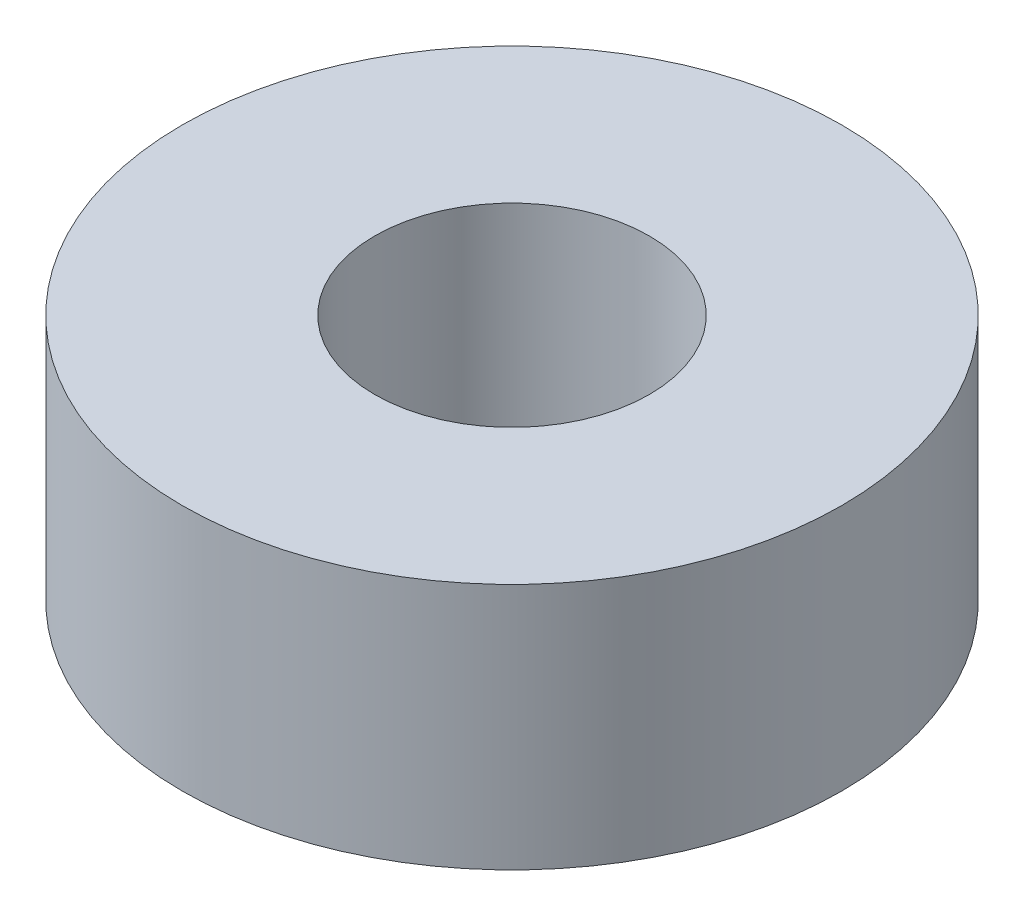
ISO-10303-21;
HEADER;
FILE_DESCRIPTION(('STEP AP214'),'2;1');
FILE_NAME('part.step','',(''),(''),'','','');
FILE_SCHEMA(('AUTOMOTIVE_DESIGN { 1 0 10303 214 1 1 1 1 }'));
ENDSEC;
DATA;
#1=APPLICATION_CONTEXT('core data for automotive mechanical design processes');
#2=APPLICATION_PROTOCOL_DEFINITION('international standard','automotive_design',2000,#1);
#3=PRODUCT_CONTEXT('',#1,'mechanical');
#4=PRODUCT('Part','Part','',(#3));
#5=PRODUCT_RELATED_PRODUCT_CATEGORY('part','',(#4));
#6=PRODUCT_DEFINITION_FORMATION('','',#4);
#7=PRODUCT_DEFINITION_CONTEXT('part definition',#1,'design');
#8=PRODUCT_DEFINITION('design','',#6,#7);
#9=PRODUCT_DEFINITION_SHAPE('','',#8);
#10=(LENGTH_UNIT() NAMED_UNIT(*) SI_UNIT(.MILLI.,.METRE.));
#11=(NAMED_UNIT(*) PLANE_ANGLE_UNIT() SI_UNIT($,.RADIAN.));
#12=(NAMED_UNIT(*) SI_UNIT($,.STERADIAN.) SOLID_ANGLE_UNIT());
#13=UNCERTAINTY_MEASURE_WITH_UNIT(LENGTH_MEASURE(1.E-05),#10,'distance_accuracy_value','');
#14=(GEOMETRIC_REPRESENTATION_CONTEXT(3) GLOBAL_UNCERTAINTY_ASSIGNED_CONTEXT((#13)) GLOBAL_UNIT_ASSIGNED_CONTEXT((#10,
#11,#12)) REPRESENTATION_CONTEXT('',''));
#15=CARTESIAN_POINT('',(0.,0.,0.));
#16=DIRECTION('',(0.,0.,1.));
#17=DIRECTION('',(1.,0.,0.));
#18=AXIS2_PLACEMENT_3D('',#15,#16,#17);
#19=CARTESIAN_POINT('',(0.,4.5,0.));
#20=DIRECTION('',(0.,1.,0.));
#21=DIRECTION('',(0.,0.,1.));
#22=AXIS2_PLACEMENT_3D('',#19,#20,#21);
#23=PLANE('',#22);
#24=CARTESIAN_POINT('',(0.,4.5,0.));
#25=DIRECTION('',(0.,1.,0.));
#26=DIRECTION('',(0.,0.,1.));
#27=AXIS2_PLACEMENT_3D('',#24,#25,#26);
#28=CIRCLE('',#27,6.);
#29=CARTESIAN_POINT('',(0.,4.5,6.));
#30=VERTEX_POINT('',#29);
#31=EDGE_CURVE('E10',#30,#30,#28,.T.);
#32=ORIENTED_EDGE('',*,*,#31,.T.);
#33=EDGE_LOOP('',(#32));
#34=FACE_BOUND('',#33,.T.);
#35=CARTESIAN_POINT('',(0.,4.5,0.));
#36=DIRECTION('',(0.,1.,0.));
#37=DIRECTION('',(0.,0.,1.));
#38=AXIS2_PLACEMENT_3D('',#35,#36,#37);
#39=CIRCLE('',#38,2.5);
#40=CARTESIAN_POINT('',(0.,4.5,2.5));
#41=VERTEX_POINT('',#40);
#42=EDGE_CURVE('E48',#41,#41,#39,.T.);
#43=ORIENTED_EDGE('',*,*,#42,.F.);
#44=EDGE_LOOP('',(#43));
#45=FACE_BOUND('',#44,.T.);
#46=ADVANCED_FACE('F37',(#34,#45),#23,.T.);
#47=CARTESIAN_POINT('',(0.,0.,0.));
#48=DIRECTION('',(0.,1.,0.));
#49=DIRECTION('',(0.,0.,1.));
#50=AXIS2_PLACEMENT_3D('',#47,#48,#49);
#51=PLANE('',#50);
#52=CARTESIAN_POINT('',(0.,0.,0.));
#53=DIRECTION('',(0.,1.,0.));
#54=DIRECTION('',(0.,0.,1.));
#55=AXIS2_PLACEMENT_3D('',#52,#53,#54);
#56=CIRCLE('',#55,6.);
#57=CARTESIAN_POINT('',(0.,0.,6.));
#58=VERTEX_POINT('',#57);
#59=EDGE_CURVE('E41',#58,#58,#56,.T.);
#60=ORIENTED_EDGE('',*,*,#59,.F.);
#61=EDGE_LOOP('',(#60));
#62=FACE_BOUND('',#61,.T.);
#63=CARTESIAN_POINT('',(0.,0.,0.));
#64=DIRECTION('',(0.,1.,0.));
#65=DIRECTION('',(0.,0.,1.));
#66=AXIS2_PLACEMENT_3D('',#63,#64,#65);
#67=CIRCLE('',#66,2.5);
#68=CARTESIAN_POINT('',(0.,0.,2.5));
#69=VERTEX_POINT('',#68);
#70=EDGE_CURVE('E50',#69,#69,#67,.T.);
#71=ORIENTED_EDGE('',*,*,#70,.T.);
#72=EDGE_LOOP('',(#71));
#73=FACE_BOUND('',#72,.T.);
#74=ADVANCED_FACE('F60',(#62,#73),#51,.F.);
#75=CARTESIAN_POINT('',(0.,4.5,0.));
#76=DIRECTION('',(0.,-1.,0.));
#77=DIRECTION('',(0.,0.,-1.));
#78=AXIS2_PLACEMENT_3D('',#75,#76,#77);
#79=CYLINDRICAL_SURFACE('',#78,6.);
#80=ORIENTED_EDGE('',*,*,#31,.F.);
#81=EDGE_LOOP('',(#80));
#82=FACE_BOUND('',#81,.T.);
#83=ORIENTED_EDGE('',*,*,#59,.T.);
#84=EDGE_LOOP('',(#83));
#85=FACE_BOUND('',#84,.T.);
#86=ADVANCED_FACE('F39',(#82,#85),#79,.T.);
#87=CARTESIAN_POINT('',(0.,4.5,0.));
#88=DIRECTION('',(0.,-1.,0.));
#89=DIRECTION('',(0.,0.,-1.));
#90=AXIS2_PLACEMENT_3D('',#87,#88,#89);
#91=CYLINDRICAL_SURFACE('',#90,2.5);
#92=ORIENTED_EDGE('',*,*,#42,.T.);
#93=EDGE_LOOP('',(#92));
#94=FACE_BOUND('',#93,.T.);
#95=ORIENTED_EDGE('',*,*,#70,.F.);
#96=EDGE_LOOP('',(#95));
#97=FACE_BOUND('',#96,.T.);
#98=ADVANCED_FACE('F56',(#94,#97),#91,.F.);
#99=CLOSED_SHELL('',(#46,#74,#86,#98));
#100=MANIFOLD_SOLID_BREP('B2',#99);
#101=ADVANCED_BREP_SHAPE_REPRESENTATION('',(#18,#100),#14);
#102=SHAPE_DEFINITION_REPRESENTATION(#9,#101);
ENDSEC;
END-ISO-10303-21;
